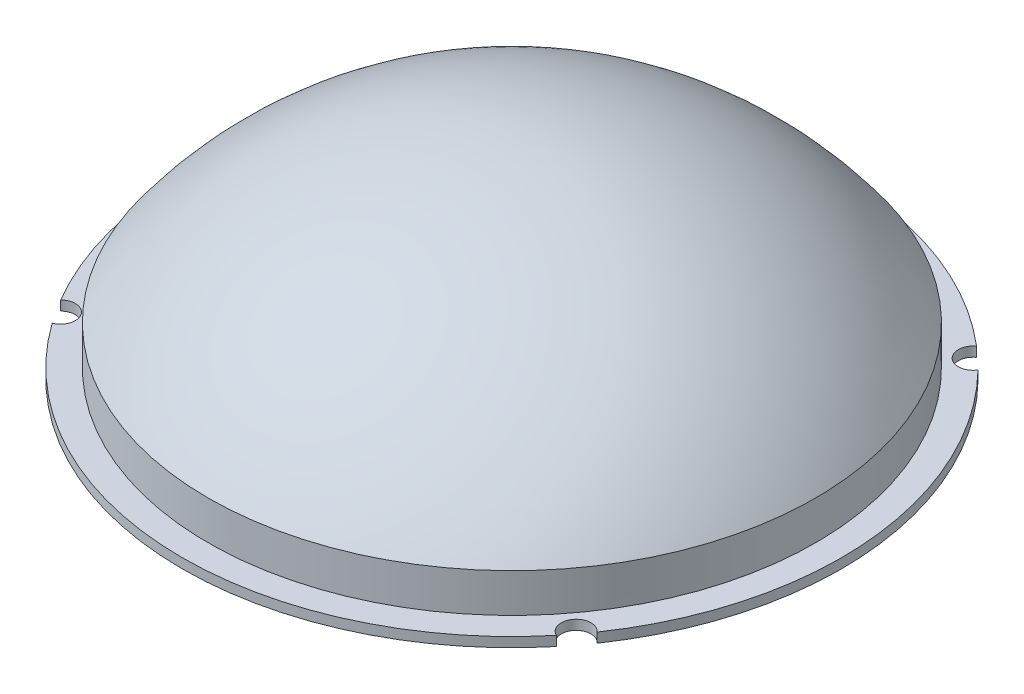
ISO-10303-21;
HEADER;
FILE_DESCRIPTION(('STEP AP214'),'2;1');
FILE_NAME('part.step','',(''),(''),'','','');
FILE_SCHEMA(('AUTOMOTIVE_DESIGN { 1 0 10303 214 1 1 1 1 }'));
ENDSEC;
DATA;
#1=APPLICATION_CONTEXT('core data for automotive mechanical design processes');
#2=APPLICATION_PROTOCOL_DEFINITION('international standard','automotive_design',2000,#1);
#3=PRODUCT_CONTEXT('',#1,'mechanical');
#4=PRODUCT('Part','Part','',(#3));
#5=PRODUCT_RELATED_PRODUCT_CATEGORY('part','',(#4));
#6=PRODUCT_DEFINITION_FORMATION('','',#4);
#7=PRODUCT_DEFINITION_CONTEXT('part definition',#1,'design');
#8=PRODUCT_DEFINITION('design','',#6,#7);
#9=PRODUCT_DEFINITION_SHAPE('','',#8);
#10=(LENGTH_UNIT() NAMED_UNIT(*) SI_UNIT(.MILLI.,.METRE.));
#11=(NAMED_UNIT(*) PLANE_ANGLE_UNIT() SI_UNIT($,.RADIAN.));
#12=(NAMED_UNIT(*) SI_UNIT($,.STERADIAN.) SOLID_ANGLE_UNIT());
#13=UNCERTAINTY_MEASURE_WITH_UNIT(LENGTH_MEASURE(1.E-05),#10,'distance_accuracy_value','');
#14=(GEOMETRIC_REPRESENTATION_CONTEXT(3) GLOBAL_UNCERTAINTY_ASSIGNED_CONTEXT((#13)) GLOBAL_UNIT_ASSIGNED_CONTEXT((#10,
#11,#12)) REPRESENTATION_CONTEXT('',''));
#15=CARTESIAN_POINT('',(0.,0.,0.));
#16=DIRECTION('',(0.,0.,1.));
#17=DIRECTION('',(1.,0.,0.));
#18=AXIS2_PLACEMENT_3D('',#15,#16,#17);
#19=CARTESIAN_POINT('',(0.,1.905,0.));
#20=DIRECTION('',(0.,-1.,0.));
#21=DIRECTION('',(0.,0.,-1.));
#22=AXIS2_PLACEMENT_3D('',#19,#20,#21);
#23=CYLINDRICAL_SURFACE('',#22,64.77);
#24=DIRECTION('',(0.,1.,0.));
#25=VECTOR('',#24,1.);
#26=CARTESIAN_POINT('',(-55.8276729377156,0.9525,32.8393640979762));
#27=LINE('',#26,#25);
#28=CARTESIAN_POINT('',(-55.8276729377156,1.905,32.8393640979762));
#29=VERTEX_POINT('',#28);
#30=CARTESIAN_POINT('',(-55.8276729377157,0.,32.8393640979762));
#31=VERTEX_POINT('',#30);
#32=EDGE_CURVE('E150',#29,#31,#27,.F.);
#33=ORIENTED_EDGE('',*,*,#32,.F.);
#34=CARTESIAN_POINT('',(0.,1.905,0.));
#35=DIRECTION('',(0.,-1.,0.));
#36=DIRECTION('',(0.,0.,-1.));
#37=AXIS2_PLACEMENT_3D('',#34,#35,#36);
#38=CIRCLE('',#37,64.77);
#39=CARTESIAN_POINT('',(-43.786968281351,1.905,-47.7268719771992));
#40=VERTEX_POINT('',#39);
#41=EDGE_CURVE('E145',#29,#40,#38,.T.);
#42=ORIENTED_EDGE('',*,*,#41,.T.);
#43=DIRECTION('',(0.,1.,0.));
#44=VECTOR('',#43,1.);
#45=CARTESIAN_POINT('',(-43.7869682813507,0.9525,-47.7268719771993));
#46=LINE('',#45,#44);
#47=CARTESIAN_POINT('',(-43.7869682813508,0.,-47.7268719771994));
#48=VERTEX_POINT('',#47);
#49=EDGE_CURVE('E58',#48,#40,#46,.T.);
#50=ORIENTED_EDGE('',*,*,#49,.F.);
#51=CARTESIAN_POINT('',(0.,0.,0.));
#52=DIRECTION('',(0.,-1.,0.));
#53=DIRECTION('',(0.,0.,-1.));
#54=AXIS2_PLACEMENT_3D('',#51,#52,#53);
#55=CIRCLE('',#54,64.77);
#56=EDGE_CURVE('E147',#31,#48,#55,.T.);
#57=ORIENTED_EDGE('',*,*,#56,.F.);
#58=EDGE_LOOP('',(#33,#42,#50,#57));
#59=FACE_BOUND('',#58,.T.);
#60=ADVANCED_FACE('F42',(#59),#23,.T.);
#61=DIRECTION('',(0.,1.,0.));
#62=VECTOR('',#61,1.);
#63=CARTESIAN_POINT('',(46.2247912465298,0.9525,-45.3698311018978));
#64=LINE('',#63,#62);
#65=CARTESIAN_POINT('',(46.2247912465298,1.905,-45.3698311018978));
#66=VERTEX_POINT('',#65);
#67=CARTESIAN_POINT('',(46.2247912465299,0.,-45.3698311018978));
#68=VERTEX_POINT('',#67);
#69=EDGE_CURVE('E160',#66,#68,#64,.F.);
#70=ORIENTED_EDGE('',*,*,#69,.F.);
#71=CARTESIAN_POINT('',(53.4009212928544,1.905,36.6537106590093));
#72=VERTEX_POINT('',#71);
#73=EDGE_CURVE('E129',#66,#72,#38,.T.);
#74=ORIENTED_EDGE('',*,*,#73,.T.);
#75=DIRECTION('',(0.,1.,0.));
#76=VECTOR('',#75,1.);
#77=CARTESIAN_POINT('',(53.4009212928541,0.9525,36.6537106590095));
#78=LINE('',#77,#76);
#79=CARTESIAN_POINT('',(53.4009212928542,0.,36.6537106590096));
#80=VERTEX_POINT('',#79);
#81=EDGE_CURVE('E110',#80,#72,#78,.T.);
#82=ORIENTED_EDGE('',*,*,#81,.F.);
#83=EDGE_CURVE('E127',#68,#80,#55,.T.);
#84=ORIENTED_EDGE('',*,*,#83,.F.);
#85=EDGE_LOOP('',(#70,#74,#82,#84));
#86=FACE_BOUND('',#85,.T.);
#87=ADVANCED_FACE('F126',(#86),#23,.T.);
#88=DIRECTION('',(0.,1.,0.));
#89=VECTOR('',#88,1.);
#90=CARTESIAN_POINT('',(42.0348340366972,0.9525,-49.2770294103379));
#91=LINE('',#90,#89);
#92=CARTESIAN_POINT('',(42.0348340366973,0.,-49.277029410338));
#93=VERTEX_POINT('',#92);
#94=CARTESIAN_POINT('',(42.034834036697,1.905,-49.2770294103382));
#95=VERTEX_POINT('',#94);
#96=EDGE_CURVE('E165',#93,#95,#91,.T.);
#97=ORIENTED_EDGE('',*,*,#96,.F.);
#98=CARTESIAN_POINT('',(-39.398266302551,0.,-51.4094301889573));
#99=VERTEX_POINT('',#98);
#100=EDGE_CURVE('E141',#99,#93,#55,.T.);
#101=ORIENTED_EDGE('',*,*,#100,.F.);
#102=DIRECTION('',(0.,1.,0.));
#103=VECTOR('',#102,1.);
#104=CARTESIAN_POINT('',(-39.398266302551,0.9525,-51.4094301889572));
#105=LINE('',#104,#103);
#106=CARTESIAN_POINT('',(-39.398266302551,1.905,-51.4094301889572));
#107=VERTEX_POINT('',#106);
#108=EDGE_CURVE('E168',#107,#99,#105,.F.);
#109=ORIENTED_EDGE('',*,*,#108,.F.);
#110=EDGE_CURVE('E138',#107,#95,#38,.T.);
#111=ORIENTED_EDGE('',*,*,#110,.T.);
#112=EDGE_LOOP('',(#97,#101,#109,#111));
#113=FACE_BOUND('',#112,.T.);
#114=ADVANCED_FACE('F221',(#113),#23,.T.);
#115=CARTESIAN_POINT('',(0.,0.,0.));
#116=DIRECTION('',(0.,1.,0.));
#117=DIRECTION('',(0.,0.,1.));
#118=AXIS2_PLACEMENT_3D('',#115,#116,#117);
#119=PLANE('',#118);
#120=CARTESIAN_POINT('',(0.,0.,0.));
#121=DIRECTION('',(0.,1.,0.));
#122=DIRECTION('',(0.,0.,1.));
#123=AXIS2_PLACEMENT_3D('',#120,#121,#122);
#124=CIRCLE('',#123,57.785);
#125=CARTESIAN_POINT('',(0.,0.,-57.785));
#126=VERTEX_POINT('',#125);
#127=EDGE_CURVE('E197',#126,#126,#124,.T.);
#128=ORIENTED_EDGE('',*,*,#127,.T.);
#129=EDGE_LOOP('',(#128));
#130=FACE_BOUND('',#129,.T.);
#131=CARTESIAN_POINT('',(49.9530968138656,0.,41.2291282797074));
#132=VERTEX_POINT('',#131);
#133=CARTESIAN_POINT('',(-52.7074121849974,0.,37.6441443090527));
#134=VERTEX_POINT('',#133);
#135=EDGE_CURVE('E139',#132,#134,#55,.T.);
#136=ORIENTED_EDGE('',*,*,#135,.T.);
#137=CARTESIAN_POINT('',(-53.7881368751796,0.,34.9304245106891));
#138=DIRECTION('',(0.,1.,0.));
#139=DIRECTION('',(0.,0.,1.));
#140=AXIS2_PLACEMENT_3D('',#137,#138,#139);
#141=CIRCLE('',#140,2.921);
#142=EDGE_CURVE('E131',#134,#31,#141,.T.);
#143=ORIENTED_EDGE('',*,*,#142,.T.);
#144=ORIENTED_EDGE('',*,*,#56,.T.);
#145=CARTESIAN_POINT('',(-41.2251833472463,0.,-49.1302603594356));
#146=DIRECTION('',(0.,1.,0.));
#147=DIRECTION('',(0.,0.,1.));
#148=AXIS2_PLACEMENT_3D('',#145,#146,#147);
#149=CIRCLE('',#148,2.921);
#150=EDGE_CURVE('E120',#48,#99,#149,.T.);
#151=ORIENTED_EDGE('',*,*,#150,.T.);
#152=ORIENTED_EDGE('',*,*,#100,.T.);
#153=CARTESIAN_POINT('',(43.7399648226084,0.,-46.9053696533454));
#154=DIRECTION('',(0.,1.,0.));
#155=DIRECTION('',(0.,0.,1.));
#156=AXIS2_PLACEMENT_3D('',#153,#154,#155);
#157=CIRCLE('',#156,2.921);
#158=EDGE_CURVE('E136',#93,#68,#157,.T.);
#159=ORIENTED_EDGE('',*,*,#158,.T.);
#160=ORIENTED_EDGE('',*,*,#83,.T.);
#161=CARTESIAN_POINT('',(51.2204884368829,0.,38.5974065098569));
#162=DIRECTION('',(0.,1.,0.));
#163=DIRECTION('',(0.,0.,1.));
#164=AXIS2_PLACEMENT_3D('',#161,#162,#163);
#165=CIRCLE('',#164,2.921);
#166=EDGE_CURVE('E107',#80,#132,#165,.T.);
#167=ORIENTED_EDGE('',*,*,#166,.T.);
#168=EDGE_LOOP('',(#136,#143,#144,#151,#152,#159,#160,#167));
#169=FACE_BOUND('',#168,.T.);
#170=ADVANCED_FACE('F134',(#130,#169),#119,.F.);
#171=CARTESIAN_POINT('',(0.,9.525,0.));
#172=DIRECTION('',(0.,-1.,0.));
#173=DIRECTION('',(0.,0.,-1.));
#174=AXIS2_PLACEMENT_3D('',#171,#172,#173);
#175=CYLINDRICAL_SURFACE('',#174,57.785);
#176=CARTESIAN_POINT('',(0.,8.90341615820496,0.));
#177=DIRECTION('',(0.,-1.,0.));
#178=DIRECTION('',(0.,0.,-1.));
#179=AXIS2_PLACEMENT_3D('',#176,#177,#178);
#180=CIRCLE('',#179,57.785);
#181=CARTESIAN_POINT('',(0.,8.90341615820496,-57.785));
#182=VERTEX_POINT('',#181);
#183=EDGE_CURVE('E200',#182,#182,#180,.F.);
#184=CARTESIAN_POINT('',(0.,8.90341615820496,-57.785));
#185=CARTESIAN_POINT('',(0.,8.81067223989033,-57.785));
#186=CARTESIAN_POINT('',(0.,8.71792832157569,-57.785));
#187=CARTESIAN_POINT('',(0.,8.53244048494642,-57.785));
#188=CARTESIAN_POINT('',(0.,8.43969656663179,-57.785));
#189=CARTESIAN_POINT('',(0.,8.25420873000252,-57.785));
#190=CARTESIAN_POINT('',(0.,8.16146481168788,-57.785));
#191=CARTESIAN_POINT('',(0.,7.97597697505861,-57.785));
#192=CARTESIAN_POINT('',(0.,7.88323305674398,-57.785));
#193=CARTESIAN_POINT('',(0.,7.69774522011471,-57.785));
#194=CARTESIAN_POINT('',(0.,7.60500130180007,-57.785));
#195=CARTESIAN_POINT('',(0.,7.4195134651708,-57.785));
#196=CARTESIAN_POINT('',(0.,7.32676954685617,-57.785));
#197=CARTESIAN_POINT('',(0.,7.1412817102269,-57.785));
#198=CARTESIAN_POINT('',(0.,7.04853779191226,-57.785));
#199=CARTESIAN_POINT('',(0.,6.86304995528299,-57.785));
#200=CARTESIAN_POINT('',(0.,6.77030603696836,-57.785));
#201=CARTESIAN_POINT('',(0.,6.58481820033909,-57.785));
#202=CARTESIAN_POINT('',(0.,6.49207428202445,-57.785));
#203=CARTESIAN_POINT('',(0.,6.30658644539518,-57.785));
#204=CARTESIAN_POINT('',(0.,6.21384252708055,-57.785));
#205=CARTESIAN_POINT('',(0.,6.02835469045128,-57.785));
#206=CARTESIAN_POINT('',(0.,5.93561077213664,-57.785));
#207=CARTESIAN_POINT('',(0.,5.75012293550737,-57.785));
#208=CARTESIAN_POINT('',(0.,5.65737901719274,-57.785));
#209=CARTESIAN_POINT('',(0.,5.47189118056347,-57.785));
#210=CARTESIAN_POINT('',(0.,5.37914726224883,-57.785));
#211=CARTESIAN_POINT('',(0.,5.19365942561956,-57.785));
#212=CARTESIAN_POINT('',(0.,5.10091550730493,-57.785));
#213=CARTESIAN_POINT('',(0.,4.91542767067566,-57.785));
#214=CARTESIAN_POINT('',(0.,4.82268375236102,-57.785));
#215=CARTESIAN_POINT('',(0.,4.63719591573175,-57.785));
#216=CARTESIAN_POINT('',(0.,4.54445199741712,-57.785));
#217=CARTESIAN_POINT('',(0.,4.35896416078784,-57.785));
#218=CARTESIAN_POINT('',(0.,4.26622024247321,-57.785));
#219=CARTESIAN_POINT('',(0.,4.08073240584394,-57.785));
#220=CARTESIAN_POINT('',(0.,3.9879884875293,-57.785));
#221=CARTESIAN_POINT('',(0.,3.80250065090003,-57.785));
#222=CARTESIAN_POINT('',(0.,3.7097567325854,-57.785));
#223=CARTESIAN_POINT('',(0.,3.52426889595613,-57.785));
#224=CARTESIAN_POINT('',(0.,3.4315249776415,-57.785));
#225=CARTESIAN_POINT('',(0.,3.24603714101223,-57.785));
#226=CARTESIAN_POINT('',(0.,3.15329322269759,-57.785));
#227=CARTESIAN_POINT('',(0.,2.96780538606832,-57.785));
#228=CARTESIAN_POINT('',(0.,2.87506146775368,-57.785));
#229=CARTESIAN_POINT('',(0.,2.68957363112441,-57.785));
#230=CARTESIAN_POINT('',(0.,2.59682971280978,-57.785));
#231=CARTESIAN_POINT('',(0.,2.41134187618051,-57.785));
#232=CARTESIAN_POINT('',(0.,2.31859795786587,-57.785));
#233=CARTESIAN_POINT('',(0.,2.1331101212366,-57.785));
#234=CARTESIAN_POINT('',(0.,2.04036620292197,-57.785));
#235=CARTESIAN_POINT('',(0.,1.8548783662927,-57.785));
#236=CARTESIAN_POINT('',(0.,1.76213444797807,-57.785));
#237=CARTESIAN_POINT('',(0.,1.5766466113488,-57.785));
#238=CARTESIAN_POINT('',(0.,1.48390269303416,-57.785));
#239=CARTESIAN_POINT('',(0.,1.29841485640489,-57.785));
#240=CARTESIAN_POINT('',(0.,1.20567093809025,-57.785));
#241=CARTESIAN_POINT('',(0.,1.02018310146098,-57.785));
#242=CARTESIAN_POINT('',(0.,0.92743918314635,-57.785));
#243=CARTESIAN_POINT('',(0.,0.74195134651708,-57.785));
#244=CARTESIAN_POINT('',(0.,0.649207428202445,-57.785));
#245=CARTESIAN_POINT('',(0.,0.463719591573174,-57.785));
#246=CARTESIAN_POINT('',(0.,0.370975673258538,-57.785));
#247=CARTESIAN_POINT('',(0.,0.185487836629269,-57.785));
#248=CARTESIAN_POINT('',(0.,0.0927439183146344,-57.785));
#249=CARTESIAN_POINT('',(0.,0.,-57.785));
#250=B_SPLINE_CURVE_WITH_KNOTS('',3,(#184,#185,#186,#187,#188,#189,#190,#191,#192,#193,#194,
#195,#196,#197,#198,#199,#200,#201,#202,#203,#204,#205,#206,#207,#208,#209,#210,#211,#212,#213,
#214,#215,#216,#217,#218,#219,#220,#221,#222,#223,#224,#225,#226,#227,#228,#229,#230,#231,#232,
#233,#234,#235,#236,#237,#238,#239,#240,#241,#242,#243,#244,#245,#246,#247,#248,#249),
.UNSPECIFIED.,.F.,.F.,(4,2,2,2,2,2,2,2,2,2,2,2,2,2,2,2,2,2,2,2,2,2,2,2,2,2,2,2,2,2,2,2,4),(0.,
0.278231754943906,0.556463509887811,0.834695264831715,1.11292701977562,1.39115877471953,
1.66939052966343,1.94762228460734,2.22585403955124,2.50408579449515,2.78231754943905,
3.06054930438296,3.33878105932686,3.61701281427077,3.89524456921467,4.17347632415858,
4.45170807910248,4.72993983404639,5.00817158899029,5.2864033439342,5.5646350988781,
5.84286685382201,6.12109860876591,6.39933036370982,6.67756211865372,6.95579387359763,
7.23402562854153,7.51225738348544,7.79048913842934,8.06872089337325,8.34695264831715,
8.62518440326106,8.90341615820496),.UNSPECIFIED.);
#251=EDGE_CURVE('BSEAM234',#182,#126,#250,.T.);
#252=ORIENTED_EDGE('',*,*,#183,.T.);
#253=ORIENTED_EDGE('',*,*,#127,.F.);
#254=ORIENTED_EDGE('',*,*,#251,.T.);
#255=ORIENTED_EDGE('',*,*,#251,.F.);
#256=EDGE_LOOP('',(#252,#254,#253,#255));
#257=FACE_BOUND('',#256,.T.);
#258=ADVANCED_FACE('F234',(#257),#175,.F.);
#259=CARTESIAN_POINT('',(0.,-33.6814583333333,0.));
#260=DIRECTION('',(0.,0.,1.));
#261=DIRECTION('',(1.,0.,0.));
#262=AXIS2_PLACEMENT_3D('',#259,#260,#261);
#263=SPHERICAL_SURFACE('',#262,71.7814583333333);
#264=CARTESIAN_POINT('',(0.,-33.6814583333333,0.));
#265=DIRECTION('',(0.,-1.,0.));
#266=DIRECTION('',(0.,0.,-1.));
#267=AXIS2_PLACEMENT_3D('',#264,#265,#266);
#268=SPHERICAL_SURFACE('',#267,71.7814583333333);
#269=ORIENTED_EDGE('',*,*,#183,.F.);
#270=EDGE_LOOP('',(#269));
#271=FACE_BOUND('',#270,.T.);
#272=ADVANCED_FACE('F226',(#271),#268,.F.);
#273=DIRECTION('',(0.,1.,0.));
#274=VECTOR('',#273,1.);
#275=CARTESIAN_POINT('',(-52.7074121849974,0.9525,37.6441443090526));
#276=LINE('',#275,#274);
#277=CARTESIAN_POINT('',(-52.7074121849972,1.905,37.6441443090529));
#278=VERTEX_POINT('',#277);
#279=EDGE_CURVE('E66',#134,#278,#276,.T.);
#280=ORIENTED_EDGE('',*,*,#279,.F.);
#281=ORIENTED_EDGE('',*,*,#135,.F.);
#282=DIRECTION('',(0.,1.,0.));
#283=VECTOR('',#282,1.);
#284=CARTESIAN_POINT('',(49.9530968138655,0.9525,41.2291282797074));
#285=LINE('',#284,#283);
#286=CARTESIAN_POINT('',(49.9530968138655,1.905,41.2291282797074));
#287=VERTEX_POINT('',#286);
#288=EDGE_CURVE('E113',#287,#132,#285,.F.);
#289=ORIENTED_EDGE('',*,*,#288,.F.);
#290=EDGE_CURVE('E191',#287,#278,#38,.T.);
#291=ORIENTED_EDGE('',*,*,#290,.T.);
#292=EDGE_LOOP('',(#280,#281,#289,#291));
#293=FACE_BOUND('',#292,.T.);
#294=ADVANCED_FACE('F224',(#293),#23,.T.);
#295=CARTESIAN_POINT('',(0.,1.905,0.));
#296=DIRECTION('',(0.,-1.,0.));
#297=DIRECTION('',(0.,0.,-1.));
#298=AXIS2_PLACEMENT_3D('',#295,#296,#297);
#299=PLANE('',#298);
#300=CARTESIAN_POINT('',(0.,1.905,0.));
#301=DIRECTION('',(0.,-1.,0.));
#302=DIRECTION('',(0.,0.,-1.));
#303=AXIS2_PLACEMENT_3D('',#300,#301,#302);
#304=CIRCLE('',#303,59.69);
#305=CARTESIAN_POINT('',(0.,1.905,-59.69));
#306=VERTEX_POINT('',#305);
#307=EDGE_CURVE('E211',#306,#306,#304,.T.);
#308=ORIENTED_EDGE('',*,*,#307,.T.);
#309=EDGE_LOOP('',(#308));
#310=FACE_BOUND('',#309,.T.);
#311=ORIENTED_EDGE('',*,*,#41,.F.);
#312=CARTESIAN_POINT('',(-53.7881368751796,1.905,34.9304245106891));
#313=DIRECTION('',(0.,1.,0.));
#314=DIRECTION('',(0.,0.,1.));
#315=AXIS2_PLACEMENT_3D('',#312,#313,#314);
#316=CIRCLE('',#315,2.921);
#317=EDGE_CURVE('E179',#278,#29,#316,.T.);
#318=ORIENTED_EDGE('',*,*,#317,.F.);
#319=ORIENTED_EDGE('',*,*,#290,.F.);
#320=CARTESIAN_POINT('',(51.2204884368829,1.905,38.5974065098569));
#321=DIRECTION('',(0.,1.,0.));
#322=DIRECTION('',(0.,0.,1.));
#323=AXIS2_PLACEMENT_3D('',#320,#321,#322);
#324=CIRCLE('',#323,2.921);
#325=EDGE_CURVE('E119',#72,#287,#324,.T.);
#326=ORIENTED_EDGE('',*,*,#325,.F.);
#327=ORIENTED_EDGE('',*,*,#73,.F.);
#328=CARTESIAN_POINT('',(43.7399648226084,1.905,-46.9053696533454));
#329=DIRECTION('',(0.,-1.,0.));
#330=DIRECTION('',(0.,0.,-1.));
#331=AXIS2_PLACEMENT_3D('',#328,#329,#330);
#332=CIRCLE('',#331,2.921);
#333=EDGE_CURVE('E11',#66,#95,#332,.T.);
#334=ORIENTED_EDGE('',*,*,#333,.T.);
#335=ORIENTED_EDGE('',*,*,#110,.F.);
#336=CARTESIAN_POINT('',(-41.2251833472463,1.905,-49.1302603594356));
#337=DIRECTION('',(0.,-1.,0.));
#338=DIRECTION('',(0.,0.,-1.));
#339=AXIS2_PLACEMENT_3D('',#336,#337,#338);
#340=CIRCLE('',#339,2.921);
#341=EDGE_CURVE('E51',#107,#40,#340,.T.);
#342=ORIENTED_EDGE('',*,*,#341,.T.);
#343=EDGE_LOOP('',(#311,#318,#319,#326,#327,#334,#335,#342));
#344=FACE_BOUND('',#343,.T.);
#345=ADVANCED_FACE('F216',(#310,#344),#299,.F.);
#346=CARTESIAN_POINT('',(0.,-33.6814583333333,0.));
#347=DIRECTION('',(0.,0.,1.));
#348=DIRECTION('',(1.,0.,0.));
#349=AXIS2_PLACEMENT_3D('',#346,#347,#348);
#350=SPHERICAL_SURFACE('',#349,73.6864583333333);
#351=CARTESIAN_POINT('',(0.,-33.6814583333333,0.));
#352=DIRECTION('',(0.,1.,0.));
#353=DIRECTION('',(0.,0.,1.));
#354=AXIS2_PLACEMENT_3D('',#351,#352,#353);
#355=SPHERICAL_SURFACE('',#354,73.6864583333333);
#356=CARTESIAN_POINT('',(0.,9.525,0.));
#357=DIRECTION('',(0.,1.,0.));
#358=DIRECTION('',(0.,0.,1.));
#359=AXIS2_PLACEMENT_3D('',#356,#357,#358);
#360=CIRCLE('',#359,59.69);
#361=CARTESIAN_POINT('',(0.,9.525,-59.69));
#362=VERTEX_POINT('',#361);
#363=EDGE_CURVE('E206',#362,#362,#360,.T.);
#364=ORIENTED_EDGE('',*,*,#363,.T.);
#365=EDGE_LOOP('',(#364));
#366=FACE_BOUND('',#365,.T.);
#367=ADVANCED_FACE('F44',(#366),#355,.T.);
#368=CARTESIAN_POINT('',(0.,9.525,0.));
#369=DIRECTION('',(0.,-1.,0.));
#370=DIRECTION('',(0.,0.,-1.));
#371=AXIS2_PLACEMENT_3D('',#368,#369,#370);
#372=CYLINDRICAL_SURFACE('',#371,59.69);
#373=CARTESIAN_POINT('',(0.,9.525,-59.69));
#374=CARTESIAN_POINT('',(0.,9.445625,-59.69));
#375=CARTESIAN_POINT('',(0.,9.36625,-59.69));
#376=CARTESIAN_POINT('',(0.,9.2075,-59.69));
#377=CARTESIAN_POINT('',(0.,9.128125,-59.69));
#378=CARTESIAN_POINT('',(0.,8.969375,-59.69));
#379=CARTESIAN_POINT('',(0.,8.89,-59.69));
#380=CARTESIAN_POINT('',(0.,8.73125,-59.69));
#381=CARTESIAN_POINT('',(0.,8.651875,-59.69));
#382=CARTESIAN_POINT('',(0.,8.493125,-59.69));
#383=CARTESIAN_POINT('',(0.,8.41375,-59.69));
#384=CARTESIAN_POINT('',(0.,8.255,-59.69));
#385=CARTESIAN_POINT('',(0.,8.175625,-59.69));
#386=CARTESIAN_POINT('',(0.,8.016875,-59.69));
#387=CARTESIAN_POINT('',(0.,7.9375,-59.69));
#388=CARTESIAN_POINT('',(0.,7.77875,-59.69));
#389=CARTESIAN_POINT('',(0.,7.699375,-59.69));
#390=CARTESIAN_POINT('',(0.,7.540625,-59.69));
#391=CARTESIAN_POINT('',(0.,7.46125,-59.69));
#392=CARTESIAN_POINT('',(0.,7.3025,-59.69));
#393=CARTESIAN_POINT('',(0.,7.223125,-59.69));
#394=CARTESIAN_POINT('',(0.,7.064375,-59.69));
#395=CARTESIAN_POINT('',(0.,6.985,-59.69));
#396=CARTESIAN_POINT('',(0.,6.82625,-59.69));
#397=CARTESIAN_POINT('',(0.,6.746875,-59.69));
#398=CARTESIAN_POINT('',(0.,6.588125,-59.69));
#399=CARTESIAN_POINT('',(0.,6.50875,-59.69));
#400=CARTESIAN_POINT('',(0.,6.35,-59.69));
#401=CARTESIAN_POINT('',(0.,6.270625,-59.69));
#402=CARTESIAN_POINT('',(0.,6.111875,-59.69));
#403=CARTESIAN_POINT('',(0.,6.0325,-59.69));
#404=CARTESIAN_POINT('',(0.,5.87375,-59.69));
#405=CARTESIAN_POINT('',(0.,5.794375,-59.69));
#406=CARTESIAN_POINT('',(0.,5.635625,-59.69));
#407=CARTESIAN_POINT('',(0.,5.55625,-59.69));
#408=CARTESIAN_POINT('',(0.,5.3975,-59.69));
#409=CARTESIAN_POINT('',(0.,5.318125,-59.69));
#410=CARTESIAN_POINT('',(0.,5.159375,-59.69));
#411=CARTESIAN_POINT('',(0.,5.08,-59.69));
#412=CARTESIAN_POINT('',(0.,4.92125,-59.69));
#413=CARTESIAN_POINT('',(0.,4.841875,-59.69));
#414=CARTESIAN_POINT('',(0.,4.683125,-59.69));
#415=CARTESIAN_POINT('',(0.,4.60375,-59.69));
#416=CARTESIAN_POINT('',(0.,4.445,-59.69));
#417=CARTESIAN_POINT('',(0.,4.365625,-59.69));
#418=CARTESIAN_POINT('',(0.,4.206875,-59.69));
#419=CARTESIAN_POINT('',(0.,4.1275,-59.69));
#420=CARTESIAN_POINT('',(0.,3.96875,-59.69));
#421=CARTESIAN_POINT('',(0.,3.889375,-59.69));
#422=CARTESIAN_POINT('',(0.,3.730625,-59.69));
#423=CARTESIAN_POINT('',(0.,3.65125,-59.69));
#424=CARTESIAN_POINT('',(0.,3.4925,-59.69));
#425=CARTESIAN_POINT('',(0.,3.413125,-59.69));
#426=CARTESIAN_POINT('',(0.,3.254375,-59.69));
#427=CARTESIAN_POINT('',(0.,3.175,-59.69));
#428=CARTESIAN_POINT('',(0.,3.01625,-59.69));
#429=CARTESIAN_POINT('',(0.,2.936875,-59.69));
#430=CARTESIAN_POINT('',(0.,2.778125,-59.69));
#431=CARTESIAN_POINT('',(0.,2.69875,-59.69));
#432=CARTESIAN_POINT('',(0.,2.54,-59.69));
#433=CARTESIAN_POINT('',(0.,2.460625,-59.69));
#434=CARTESIAN_POINT('',(0.,2.301875,-59.69));
#435=CARTESIAN_POINT('',(0.,2.2225,-59.69));
#436=CARTESIAN_POINT('',(0.,2.06375,-59.69));
#437=CARTESIAN_POINT('',(0.,1.984375,-59.69));
#438=CARTESIAN_POINT('',(0.,1.905,-59.69));
#439=B_SPLINE_CURVE_WITH_KNOTS('',3,(#373,#374,#375,#376,#377,#378,#379,#380,#381,#382,#383,
#384,#385,#386,#387,#388,#389,#390,#391,#392,#393,#394,#395,#396,#397,#398,#399,#400,#401,#402,
#403,#404,#405,#406,#407,#408,#409,#410,#411,#412,#413,#414,#415,#416,#417,#418,#419,#420,#421,
#422,#423,#424,#425,#426,#427,#428,#429,#430,#431,#432,#433,#434,#435,#436,#437,#438),
.UNSPECIFIED.,.F.,.F.,(4,2,2,2,2,2,2,2,2,2,2,2,2,2,2,2,2,2,2,2,2,2,2,2,2,2,2,2,2,2,2,2,4),(0.,
0.238125,0.476250000000001,0.714375000000001,0.9525,1.190625,1.42875,1.666875,1.905,2.143125,
2.38125,2.619375,2.8575,3.095625,3.33375,3.571875,3.81,4.048125,4.28625,4.524375,4.7625,
5.000625,5.23875,5.476875,5.715,5.953125,6.19125,6.429375,6.6675,6.905625,7.14375,7.381875,
7.62),.UNSPECIFIED.);
#440=EDGE_CURVE('BSEAM258',#362,#306,#439,.T.);
#441=ORIENTED_EDGE('',*,*,#363,.F.);
#442=ORIENTED_EDGE('',*,*,#307,.F.);
#443=ORIENTED_EDGE('',*,*,#440,.T.);
#444=ORIENTED_EDGE('',*,*,#440,.F.);
#445=EDGE_LOOP('',(#441,#443,#442,#444));
#446=FACE_BOUND('',#445,.T.);
#447=ADVANCED_FACE('F258',(#446),#372,.T.);
#448=CARTESIAN_POINT('',(51.2204884368829,0.,38.5974065098569));
#449=DIRECTION('',(0.,1.,0.));
#450=DIRECTION('',(0.,0.,1.));
#451=AXIS2_PLACEMENT_3D('',#448,#449,#450);
#452=CYLINDRICAL_SURFACE('',#451,2.921);
#453=ORIENTED_EDGE('',*,*,#288,.T.);
#454=ORIENTED_EDGE('',*,*,#166,.F.);
#455=ORIENTED_EDGE('',*,*,#81,.T.);
#456=ORIENTED_EDGE('',*,*,#325,.T.);
#457=EDGE_LOOP('',(#453,#454,#455,#456));
#458=FACE_BOUND('',#457,.T.);
#459=ADVANCED_FACE('F109',(#458),#452,.F.);
#460=CARTESIAN_POINT('',(-41.2251833472463,0.,-49.1302603594356));
#461=DIRECTION('',(0.,1.,0.));
#462=DIRECTION('',(0.,0.,1.));
#463=AXIS2_PLACEMENT_3D('',#460,#461,#462);
#464=CYLINDRICAL_SURFACE('',#463,2.921);
#465=ORIENTED_EDGE('',*,*,#108,.T.);
#466=ORIENTED_EDGE('',*,*,#150,.F.);
#467=ORIENTED_EDGE('',*,*,#49,.T.);
#468=ORIENTED_EDGE('',*,*,#341,.F.);
#469=EDGE_LOOP('',(#465,#466,#467,#468));
#470=FACE_BOUND('',#469,.T.);
#471=ADVANCED_FACE('F218',(#470),#464,.F.);
#472=CARTESIAN_POINT('',(43.7399648226084,0.,-46.9053696533454));
#473=DIRECTION('',(0.,1.,0.));
#474=DIRECTION('',(0.,0.,1.));
#475=AXIS2_PLACEMENT_3D('',#472,#473,#474);
#476=CYLINDRICAL_SURFACE('',#475,2.921);
#477=ORIENTED_EDGE('',*,*,#69,.T.);
#478=ORIENTED_EDGE('',*,*,#158,.F.);
#479=ORIENTED_EDGE('',*,*,#96,.T.);
#480=ORIENTED_EDGE('',*,*,#333,.F.);
#481=EDGE_LOOP('',(#477,#478,#479,#480));
#482=FACE_BOUND('',#481,.T.);
#483=ADVANCED_FACE('F223',(#482),#476,.F.);
#484=CARTESIAN_POINT('',(-53.7881368751796,0.,34.9304245106891));
#485=DIRECTION('',(0.,1.,0.));
#486=DIRECTION('',(0.,0.,1.));
#487=AXIS2_PLACEMENT_3D('',#484,#485,#486);
#488=CYLINDRICAL_SURFACE('',#487,2.921);
#489=ORIENTED_EDGE('',*,*,#32,.T.);
#490=ORIENTED_EDGE('',*,*,#142,.F.);
#491=ORIENTED_EDGE('',*,*,#279,.T.);
#492=ORIENTED_EDGE('',*,*,#317,.T.);
#493=EDGE_LOOP('',(#489,#490,#491,#492));
#494=FACE_BOUND('',#493,.T.);
#495=ADVANCED_FACE('F326',(#494),#488,.F.);
#496=CLOSED_SHELL('',(#60,#87,#114,#170,#258,#272,#294,#345,#367,#447,#459,#471,#483,#495));
#497=MANIFOLD_SOLID_BREP('B2',#496);
#498=ADVANCED_BREP_SHAPE_REPRESENTATION('',(#18,#497),#14);
#499=SHAPE_DEFINITION_REPRESENTATION(#9,#498);
ENDSEC;
END-ISO-10303-21;
